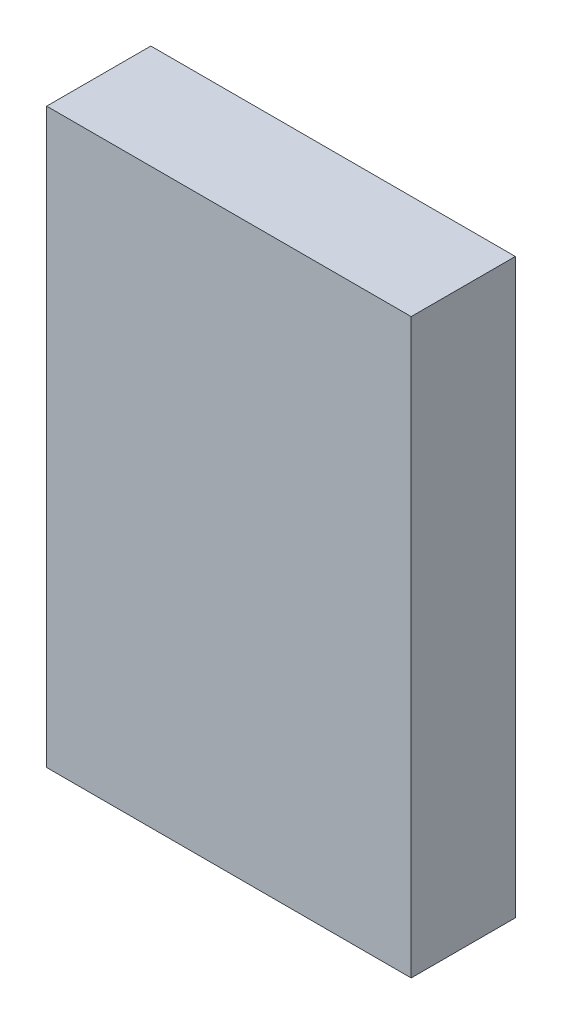
ISO-10303-21;
HEADER;
FILE_DESCRIPTION(('STEP AP214'),'2;1');
FILE_NAME('part.step','',(''),(''),'','','');
FILE_SCHEMA(('AUTOMOTIVE_DESIGN { 1 0 10303 214 1 1 1 1 }'));
ENDSEC;
DATA;
#1=APPLICATION_CONTEXT('core data for automotive mechanical design processes');
#2=APPLICATION_PROTOCOL_DEFINITION('international standard','automotive_design',2000,#1);
#3=PRODUCT_CONTEXT('',#1,'mechanical');
#4=PRODUCT('Part','Part','',(#3));
#5=PRODUCT_RELATED_PRODUCT_CATEGORY('part','',(#4));
#6=PRODUCT_DEFINITION_FORMATION('','',#4);
#7=PRODUCT_DEFINITION_CONTEXT('part definition',#1,'design');
#8=PRODUCT_DEFINITION('design','',#6,#7);
#9=PRODUCT_DEFINITION_SHAPE('','',#8);
#10=(LENGTH_UNIT() NAMED_UNIT(*) SI_UNIT(.MILLI.,.METRE.));
#11=(NAMED_UNIT(*) PLANE_ANGLE_UNIT() SI_UNIT($,.RADIAN.));
#12=(NAMED_UNIT(*) SI_UNIT($,.STERADIAN.) SOLID_ANGLE_UNIT());
#13=UNCERTAINTY_MEASURE_WITH_UNIT(LENGTH_MEASURE(1.E-05),#10,'distance_accuracy_value','');
#14=(GEOMETRIC_REPRESENTATION_CONTEXT(3) GLOBAL_UNCERTAINTY_ASSIGNED_CONTEXT((#13)) GLOBAL_UNIT_ASSIGNED_CONTEXT((#10,
#11,#12)) REPRESENTATION_CONTEXT('',''));
#15=CARTESIAN_POINT('',(0.,0.,0.));
#16=DIRECTION('',(0.,0.,1.));
#17=DIRECTION('',(1.,0.,0.));
#18=AXIS2_PLACEMENT_3D('',#15,#16,#17);
#19=CARTESIAN_POINT('',(22.225,-34.925,6.35));
#20=DIRECTION('',(-1.,0.,0.));
#21=DIRECTION('',(0.,0.,1.));
#22=AXIS2_PLACEMENT_3D('',#19,#20,#21);
#23=PLANE('',#22);
#24=DIRECTION('',(0.,1.,0.));
#25=VECTOR('',#24,1.);
#26=CARTESIAN_POINT('',(22.225,-34.925,-6.35));
#27=LINE('',#26,#25);
#28=CARTESIAN_POINT('',(22.225,-34.925,-6.35));
#29=VERTEX_POINT('',#28);
#30=CARTESIAN_POINT('',(22.225,34.925,-6.35));
#31=VERTEX_POINT('',#30);
#32=EDGE_CURVE('E98',#29,#31,#27,.T.);
#33=ORIENTED_EDGE('',*,*,#32,.T.);
#34=DIRECTION('',(0.,0.,-1.));
#35=VECTOR('',#34,1.);
#36=CARTESIAN_POINT('',(22.225,34.925,6.35));
#37=LINE('',#36,#35);
#38=CARTESIAN_POINT('',(22.225,34.925,6.35));
#39=VERTEX_POINT('',#38);
#40=EDGE_CURVE('E11',#39,#31,#37,.T.);
#41=ORIENTED_EDGE('',*,*,#40,.F.);
#42=DIRECTION('',(0.,1.,0.));
#43=VECTOR('',#42,1.);
#44=CARTESIAN_POINT('',(22.225,-34.925,6.35));
#45=LINE('',#44,#43);
#46=CARTESIAN_POINT('',(22.225,-34.925,6.35));
#47=VERTEX_POINT('',#46);
#48=EDGE_CURVE('E86',#47,#39,#45,.T.);
#49=ORIENTED_EDGE('',*,*,#48,.F.);
#50=DIRECTION('',(0.,0.,-1.));
#51=VECTOR('',#50,1.);
#52=CARTESIAN_POINT('',(22.225,-34.925,6.35));
#53=LINE('',#52,#51);
#54=EDGE_CURVE('E94',#47,#29,#53,.T.);
#55=ORIENTED_EDGE('',*,*,#54,.T.);
#56=EDGE_LOOP('',(#33,#41,#49,#55));
#57=FACE_BOUND('',#56,.T.);
#58=ADVANCED_FACE('F35',(#57),#23,.F.);
#59=CARTESIAN_POINT('',(-22.225,34.925,6.35));
#60=DIRECTION('',(0.,-1.,0.));
#61=DIRECTION('',(0.,0.,-1.));
#62=AXIS2_PLACEMENT_3D('',#59,#60,#61);
#63=PLANE('',#62);
#64=DIRECTION('',(-1.,0.,0.));
#65=VECTOR('',#64,1.);
#66=CARTESIAN_POINT('',(-22.225,34.925,-6.35));
#67=LINE('',#66,#65);
#68=CARTESIAN_POINT('',(-22.225,34.925,-6.35));
#69=VERTEX_POINT('',#68);
#70=EDGE_CURVE('E90',#31,#69,#67,.T.);
#71=ORIENTED_EDGE('',*,*,#70,.T.);
#72=DIRECTION('',(0.,0.,-1.));
#73=VECTOR('',#72,1.);
#74=CARTESIAN_POINT('',(-22.225,34.925,6.35));
#75=LINE('',#74,#73);
#76=CARTESIAN_POINT('',(-22.225,34.925,6.35));
#77=VERTEX_POINT('',#76);
#78=EDGE_CURVE('E43',#77,#69,#75,.T.);
#79=ORIENTED_EDGE('',*,*,#78,.F.);
#80=DIRECTION('',(-1.,0.,0.));
#81=VECTOR('',#80,1.);
#82=CARTESIAN_POINT('',(-22.225,34.925,6.35));
#83=LINE('',#82,#81);
#84=EDGE_CURVE('E81',#39,#77,#83,.T.);
#85=ORIENTED_EDGE('',*,*,#84,.F.);
#86=ORIENTED_EDGE('',*,*,#40,.T.);
#87=EDGE_LOOP('',(#71,#79,#85,#86));
#88=FACE_BOUND('',#87,.T.);
#89=ADVANCED_FACE('F89',(#88),#63,.F.);
#90=CARTESIAN_POINT('',(-22.225,-34.925,6.35));
#91=DIRECTION('',(1.,0.,0.));
#92=DIRECTION('',(0.,0.,-1.));
#93=AXIS2_PLACEMENT_3D('',#90,#91,#92);
#94=PLANE('',#93);
#95=DIRECTION('',(0.,-1.,0.));
#96=VECTOR('',#95,1.);
#97=CARTESIAN_POINT('',(-22.225,-34.925,-6.35));
#98=LINE('',#97,#96);
#99=CARTESIAN_POINT('',(-22.225,-34.925,-6.35));
#100=VERTEX_POINT('',#99);
#101=EDGE_CURVE('E68',#69,#100,#98,.T.);
#102=ORIENTED_EDGE('',*,*,#101,.T.);
#103=DIRECTION('',(0.,0.,-1.));
#104=VECTOR('',#103,1.);
#105=CARTESIAN_POINT('',(-22.225,-34.925,6.35));
#106=LINE('',#105,#104);
#107=CARTESIAN_POINT('',(-22.225,-34.925,6.35));
#108=VERTEX_POINT('',#107);
#109=EDGE_CURVE('E91',#108,#100,#106,.T.);
#110=ORIENTED_EDGE('',*,*,#109,.F.);
#111=DIRECTION('',(0.,-1.,0.));
#112=VECTOR('',#111,1.);
#113=CARTESIAN_POINT('',(-22.225,-34.925,6.35));
#114=LINE('',#113,#112);
#115=EDGE_CURVE('E84',#77,#108,#114,.T.);
#116=ORIENTED_EDGE('',*,*,#115,.F.);
#117=ORIENTED_EDGE('',*,*,#78,.T.);
#118=EDGE_LOOP('',(#102,#110,#116,#117));
#119=FACE_BOUND('',#118,.T.);
#120=ADVANCED_FACE('F92',(#119),#94,.F.);
#121=CARTESIAN_POINT('',(-22.225,-34.925,6.35));
#122=DIRECTION('',(0.,1.,0.));
#123=DIRECTION('',(0.,0.,1.));
#124=AXIS2_PLACEMENT_3D('',#121,#122,#123);
#125=PLANE('',#124);
#126=DIRECTION('',(1.,0.,0.));
#127=VECTOR('',#126,1.);
#128=CARTESIAN_POINT('',(-22.225,-34.925,-6.35));
#129=LINE('',#128,#127);
#130=EDGE_CURVE('E74',#100,#29,#129,.T.);
#131=ORIENTED_EDGE('',*,*,#130,.T.);
#132=ORIENTED_EDGE('',*,*,#54,.F.);
#133=DIRECTION('',(1.,0.,0.));
#134=VECTOR('',#133,1.);
#135=CARTESIAN_POINT('',(-22.225,-34.925,6.35));
#136=LINE('',#135,#134);
#137=EDGE_CURVE('E51',#108,#47,#136,.T.);
#138=ORIENTED_EDGE('',*,*,#137,.F.);
#139=ORIENTED_EDGE('',*,*,#109,.T.);
#140=EDGE_LOOP('',(#131,#132,#138,#139));
#141=FACE_BOUND('',#140,.T.);
#142=ADVANCED_FACE('F105',(#141),#125,.F.);
#143=CARTESIAN_POINT('',(0.,0.,6.35));
#144=DIRECTION('',(0.,0.,-1.));
#145=DIRECTION('',(-1.,0.,0.));
#146=AXIS2_PLACEMENT_3D('',#143,#144,#145);
#147=PLANE('',#146);
#148=ORIENTED_EDGE('',*,*,#48,.T.);
#149=ORIENTED_EDGE('',*,*,#84,.T.);
#150=ORIENTED_EDGE('',*,*,#115,.T.);
#151=ORIENTED_EDGE('',*,*,#137,.T.);
#152=EDGE_LOOP('',(#148,#149,#150,#151));
#153=FACE_BOUND('',#152,.T.);
#154=ADVANCED_FACE('F82',(#153),#147,.F.);
#155=CARTESIAN_POINT('',(0.,0.,-6.35));
#156=DIRECTION('',(0.,0.,-1.));
#157=DIRECTION('',(-1.,0.,0.));
#158=AXIS2_PLACEMENT_3D('',#155,#156,#157);
#159=PLANE('',#158);
#160=ORIENTED_EDGE('',*,*,#32,.F.);
#161=ORIENTED_EDGE('',*,*,#130,.F.);
#162=ORIENTED_EDGE('',*,*,#101,.F.);
#163=ORIENTED_EDGE('',*,*,#70,.F.);
#164=EDGE_LOOP('',(#160,#161,#162,#163));
#165=FACE_BOUND('',#164,.T.);
#166=ADVANCED_FACE('F108',(#165),#159,.T.);
#167=CLOSED_SHELL('',(#58,#89,#120,#142,#154,#166));
#168=MANIFOLD_SOLID_BREP('B2',#167);
#169=ADVANCED_BREP_SHAPE_REPRESENTATION('',(#18,#168),#14);
#170=SHAPE_DEFINITION_REPRESENTATION(#9,#169);
ENDSEC;
END-ISO-10303-21;
